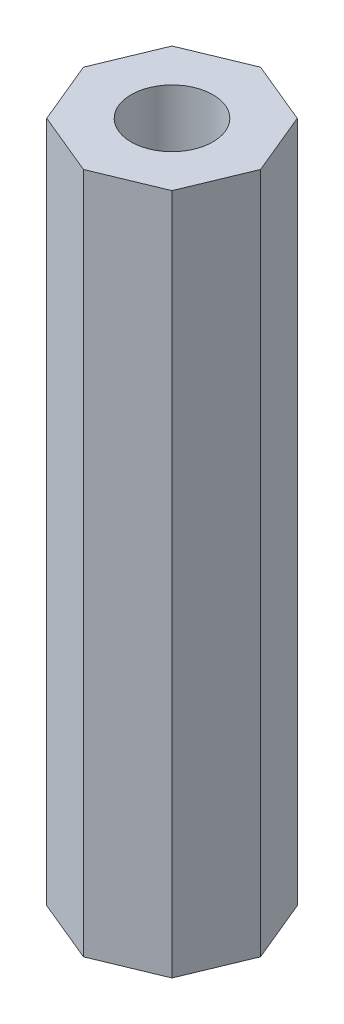
ISO-10303-21;
HEADER;
FILE_DESCRIPTION(('STEP AP214'),'2;1');
FILE_NAME('part.step','',(''),(''),'','','');
FILE_SCHEMA(('AUTOMOTIVE_DESIGN { 1 0 10303 214 1 1 1 1 }'));
ENDSEC;
DATA;
#1=APPLICATION_CONTEXT('core data for automotive mechanical design processes');
#2=APPLICATION_PROTOCOL_DEFINITION('international standard','automotive_design',2000,#1);
#3=PRODUCT_CONTEXT('',#1,'mechanical');
#4=PRODUCT('Part','Part','',(#3));
#5=PRODUCT_RELATED_PRODUCT_CATEGORY('part','',(#4));
#6=PRODUCT_DEFINITION_FORMATION('','',#4);
#7=PRODUCT_DEFINITION_CONTEXT('part definition',#1,'design');
#8=PRODUCT_DEFINITION('design','',#6,#7);
#9=PRODUCT_DEFINITION_SHAPE('','',#8);
#10=(LENGTH_UNIT() NAMED_UNIT(*) SI_UNIT(.MILLI.,.METRE.));
#11=(NAMED_UNIT(*) PLANE_ANGLE_UNIT() SI_UNIT($,.RADIAN.));
#12=(NAMED_UNIT(*) SI_UNIT($,.STERADIAN.) SOLID_ANGLE_UNIT());
#13=UNCERTAINTY_MEASURE_WITH_UNIT(LENGTH_MEASURE(1.E-05),#10,'distance_accuracy_value','');
#14=(GEOMETRIC_REPRESENTATION_CONTEXT(3) GLOBAL_UNCERTAINTY_ASSIGNED_CONTEXT((#13)) GLOBAL_UNIT_ASSIGNED_CONTEXT((#10,
#11,#12)) REPRESENTATION_CONTEXT('',''));
#15=CARTESIAN_POINT('',(0.,0.,0.));
#16=DIRECTION('',(0.,0.,1.));
#17=DIRECTION('',(1.,0.,0.));
#18=AXIS2_PLACEMENT_3D('',#15,#16,#17);
#19=CARTESIAN_POINT('',(0.,12.5,0.));
#20=DIRECTION('',(0.,1.,0.));
#21=DIRECTION('',(0.,0.,1.));
#22=AXIS2_PLACEMENT_3D('',#19,#20,#21);
#23=PLANE('',#22);
#24=DIRECTION('',(0.382683432365078,0.,-0.923879532511292));
#25=VECTOR('',#24,1.);
#26=CARTESIAN_POINT('',(1.14805029709528,12.5,1.14805029709526));
#27=LINE('',#26,#25);
#28=CARTESIAN_POINT('',(1.14805029709528,12.5,1.14805029709526));
#29=VERTEX_POINT('',#28);
#30=CARTESIAN_POINT('',(1.62358830043859,12.5,0.));
#31=VERTEX_POINT('',#30);
#32=EDGE_CURVE('E144',#29,#31,#27,.T.);
#33=ORIENTED_EDGE('',*,*,#32,.T.);
#34=DIRECTION('',(-0.382683432365101,0.,-0.923879532511282));
#35=VECTOR('',#34,1.);
#36=CARTESIAN_POINT('',(1.62358830043859,12.5,0.));
#37=LINE('',#36,#35);
#38=CARTESIAN_POINT('',(1.14805029709525,12.5,-1.14805029709528));
#39=VERTEX_POINT('',#38);
#40=EDGE_CURVE('E92',#31,#39,#37,.T.);
#41=ORIENTED_EDGE('',*,*,#40,.T.);
#42=DIRECTION('',(-0.923879532511292,0.,-0.382683432365078));
#43=VECTOR('',#42,1.);
#44=CARTESIAN_POINT('',(1.14805029709525,12.5,-1.14805029709528));
#45=LINE('',#44,#43);
#46=CARTESIAN_POINT('',(0.,12.5,-1.62358830043859));
#47=VERTEX_POINT('',#46);
#48=EDGE_CURVE('E159',#39,#47,#45,.T.);
#49=ORIENTED_EDGE('',*,*,#48,.T.);
#50=DIRECTION('',(-0.923879532511282,0.,0.382683432365101));
#51=VECTOR('',#50,1.);
#52=CARTESIAN_POINT('',(0.,12.5,-1.62358830043859));
#53=LINE('',#52,#51);
#54=CARTESIAN_POINT('',(-1.14805029709528,12.5,-1.14805029709526));
#55=VERTEX_POINT('',#54);
#56=EDGE_CURVE('E172',#47,#55,#53,.T.);
#57=ORIENTED_EDGE('',*,*,#56,.T.);
#58=DIRECTION('',(-0.382683432365078,0.,0.923879532511292));
#59=VECTOR('',#58,1.);
#60=CARTESIAN_POINT('',(-1.14805029709528,12.5,-1.14805029709526));
#61=LINE('',#60,#59);
#62=CARTESIAN_POINT('',(-1.62358830043859,12.5,0.));
#63=VERTEX_POINT('',#62);
#64=EDGE_CURVE('E111',#55,#63,#61,.T.);
#65=ORIENTED_EDGE('',*,*,#64,.T.);
#66=DIRECTION('',(0.382683432365101,0.,0.923879532511282));
#67=VECTOR('',#66,1.);
#68=CARTESIAN_POINT('',(-1.62358830043859,12.5,0.));
#69=LINE('',#68,#67);
#70=CARTESIAN_POINT('',(-1.14805029709526,12.5,1.14805029709528));
#71=VERTEX_POINT('',#70);
#72=EDGE_CURVE('E105',#63,#71,#69,.T.);
#73=ORIENTED_EDGE('',*,*,#72,.T.);
#74=DIRECTION('',(0.923879532511292,0.,0.382683432365078));
#75=VECTOR('',#74,1.);
#76=CARTESIAN_POINT('',(-1.14805029709526,12.5,1.14805029709528));
#77=LINE('',#76,#75);
#78=CARTESIAN_POINT('',(0.,12.5,1.62358830043859));
#79=VERTEX_POINT('',#78);
#80=EDGE_CURVE('E109',#71,#79,#77,.T.);
#81=ORIENTED_EDGE('',*,*,#80,.T.);
#82=DIRECTION('',(0.923879532511282,0.,-0.382683432365101));
#83=VECTOR('',#82,1.);
#84=CARTESIAN_POINT('',(0.,12.5,1.62358830043859));
#85=LINE('',#84,#83);
#86=EDGE_CURVE('E49',#79,#29,#85,.T.);
#87=ORIENTED_EDGE('',*,*,#86,.T.);
#88=EDGE_LOOP('',(#33,#41,#49,#57,#65,#73,#81,#87));
#89=FACE_BOUND('',#88,.T.);
#90=CARTESIAN_POINT('',(0.,12.5,0.));
#91=DIRECTION('',(0.,1.,0.));
#92=DIRECTION('',(0.,0.,1.));
#93=AXIS2_PLACEMENT_3D('',#90,#91,#92);
#94=CIRCLE('',#93,0.75);
#95=CARTESIAN_POINT('',(0.,12.5,0.75));
#96=VERTEX_POINT('',#95);
#97=EDGE_CURVE('E133',#96,#96,#94,.T.);
#98=ORIENTED_EDGE('',*,*,#97,.F.);
#99=EDGE_LOOP('',(#98));
#100=FACE_BOUND('',#99,.T.);
#101=ADVANCED_FACE('F32',(#89,#100),#23,.T.);
#102=CARTESIAN_POINT('',(0.,0.,0.));
#103=DIRECTION('',(0.,1.,0.));
#104=DIRECTION('',(0.,0.,1.));
#105=AXIS2_PLACEMENT_3D('',#102,#103,#104);
#106=PLANE('',#105);
#107=DIRECTION('',(0.382683432365078,0.,-0.923879532511292));
#108=VECTOR('',#107,1.);
#109=CARTESIAN_POINT('',(1.14805029709528,0.,1.14805029709526));
#110=LINE('',#109,#108);
#111=CARTESIAN_POINT('',(1.14805029709528,0.,1.14805029709526));
#112=VERTEX_POINT('',#111);
#113=CARTESIAN_POINT('',(1.62358830043859,0.,0.));
#114=VERTEX_POINT('',#113);
#115=EDGE_CURVE('E129',#112,#114,#110,.T.);
#116=ORIENTED_EDGE('',*,*,#115,.F.);
#117=DIRECTION('',(0.923879532511282,0.,-0.382683432365101));
#118=VECTOR('',#117,1.);
#119=CARTESIAN_POINT('',(0.,0.,1.62358830043859));
#120=LINE('',#119,#118);
#121=CARTESIAN_POINT('',(0.,0.,1.62358830043859));
#122=VERTEX_POINT('',#121);
#123=EDGE_CURVE('E84',#122,#112,#120,.T.);
#124=ORIENTED_EDGE('',*,*,#123,.F.);
#125=DIRECTION('',(0.923879532511292,0.,0.382683432365078));
#126=VECTOR('',#125,1.);
#127=CARTESIAN_POINT('',(-1.14805029709526,0.,1.14805029709528));
#128=LINE('',#127,#126);
#129=CARTESIAN_POINT('',(-1.14805029709526,0.,1.14805029709528));
#130=VERTEX_POINT('',#129);
#131=EDGE_CURVE('E78',#130,#122,#128,.T.);
#132=ORIENTED_EDGE('',*,*,#131,.F.);
#133=DIRECTION('',(0.382683432365101,0.,0.923879532511282));
#134=VECTOR('',#133,1.);
#135=CARTESIAN_POINT('',(-1.62358830043859,0.,0.));
#136=LINE('',#135,#134);
#137=CARTESIAN_POINT('',(-1.62358830043859,0.,0.));
#138=VERTEX_POINT('',#137);
#139=EDGE_CURVE('E119',#138,#130,#136,.T.);
#140=ORIENTED_EDGE('',*,*,#139,.F.);
#141=DIRECTION('',(-0.382683432365078,0.,0.923879532511292));
#142=VECTOR('',#141,1.);
#143=CARTESIAN_POINT('',(-1.14805029709528,0.,-1.14805029709526));
#144=LINE('',#143,#142);
#145=CARTESIAN_POINT('',(-1.14805029709528,0.,-1.14805029709526));
#146=VERTEX_POINT('',#145);
#147=EDGE_CURVE('E139',#146,#138,#144,.T.);
#148=ORIENTED_EDGE('',*,*,#147,.F.);
#149=DIRECTION('',(-0.923879532511282,0.,0.382683432365101));
#150=VECTOR('',#149,1.);
#151=CARTESIAN_POINT('',(0.,0.,-1.62358830043859));
#152=LINE('',#151,#150);
#153=CARTESIAN_POINT('',(0.,0.,-1.62358830043859));
#154=VERTEX_POINT('',#153);
#155=EDGE_CURVE('E137',#154,#146,#152,.T.);
#156=ORIENTED_EDGE('',*,*,#155,.F.);
#157=DIRECTION('',(-0.923879532511292,0.,-0.382683432365078));
#158=VECTOR('',#157,1.);
#159=CARTESIAN_POINT('',(1.14805029709525,0.,-1.14805029709528));
#160=LINE('',#159,#158);
#161=CARTESIAN_POINT('',(1.14805029709525,0.,-1.14805029709528));
#162=VERTEX_POINT('',#161);
#163=EDGE_CURVE('E135',#162,#154,#160,.T.);
#164=ORIENTED_EDGE('',*,*,#163,.F.);
#165=DIRECTION('',(-0.382683432365101,0.,-0.923879532511282));
#166=VECTOR('',#165,1.);
#167=CARTESIAN_POINT('',(1.62358830043859,0.,0.));
#168=LINE('',#167,#166);
#169=EDGE_CURVE('E132',#114,#162,#168,.T.);
#170=ORIENTED_EDGE('',*,*,#169,.F.);
#171=EDGE_LOOP('',(#116,#124,#132,#140,#148,#156,#164,#170));
#172=FACE_BOUND('',#171,.T.);
#173=CARTESIAN_POINT('',(0.,0.,0.));
#174=DIRECTION('',(0.,1.,0.));
#175=DIRECTION('',(0.,0.,1.));
#176=AXIS2_PLACEMENT_3D('',#173,#174,#175);
#177=CIRCLE('',#176,0.75);
#178=CARTESIAN_POINT('',(0.,0.,0.75));
#179=VERTEX_POINT('',#178);
#180=EDGE_CURVE('E178',#179,#179,#177,.T.);
#181=ORIENTED_EDGE('',*,*,#180,.T.);
#182=EDGE_LOOP('',(#181));
#183=FACE_BOUND('',#182,.T.);
#184=ADVANCED_FACE('F163',(#172,#183),#106,.F.);
#185=CARTESIAN_POINT('',(1.14805029709528,12.5,1.14805029709526));
#186=DIRECTION('',(-0.923879532511292,0.,-0.382683432365078));
#187=DIRECTION('',(-0.382683432365078,0.,0.923879532511292));
#188=AXIS2_PLACEMENT_3D('',#185,#186,#187);
#189=PLANE('',#188);
#190=ORIENTED_EDGE('',*,*,#115,.T.);
#191=DIRECTION('',(0.,-1.,0.));
#192=VECTOR('',#191,1.);
#193=CARTESIAN_POINT('',(1.62358830043859,12.5,0.));
#194=LINE('',#193,#192);
#195=EDGE_CURVE('E11',#31,#114,#194,.T.);
#196=ORIENTED_EDGE('',*,*,#195,.F.);
#197=ORIENTED_EDGE('',*,*,#32,.F.);
#198=DIRECTION('',(0.,-1.,0.));
#199=VECTOR('',#198,1.);
#200=CARTESIAN_POINT('',(1.14805029709528,12.5,1.14805029709526));
#201=LINE('',#200,#199);
#202=EDGE_CURVE('E125',#29,#112,#201,.T.);
#203=ORIENTED_EDGE('',*,*,#202,.T.);
#204=EDGE_LOOP('',(#190,#196,#197,#203));
#205=FACE_BOUND('',#204,.T.);
#206=ADVANCED_FACE('F34',(#205),#189,.F.);
#207=CARTESIAN_POINT('',(1.62358830043859,12.5,0.));
#208=DIRECTION('',(-0.923879532511282,0.,0.382683432365101));
#209=DIRECTION('',(0.382683432365101,0.,0.923879532511282));
#210=AXIS2_PLACEMENT_3D('',#207,#208,#209);
#211=PLANE('',#210);
#212=ORIENTED_EDGE('',*,*,#169,.T.);
#213=DIRECTION('',(0.,-1.,0.));
#214=VECTOR('',#213,1.);
#215=CARTESIAN_POINT('',(1.14805029709525,12.5,-1.14805029709528));
#216=LINE('',#215,#214);
#217=EDGE_CURVE('E41',#39,#162,#216,.T.);
#218=ORIENTED_EDGE('',*,*,#217,.F.);
#219=ORIENTED_EDGE('',*,*,#40,.F.);
#220=ORIENTED_EDGE('',*,*,#195,.T.);
#221=EDGE_LOOP('',(#212,#218,#219,#220));
#222=FACE_BOUND('',#221,.T.);
#223=ADVANCED_FACE('F206',(#222),#211,.F.);
#224=CARTESIAN_POINT('',(1.14805029709525,12.5,-1.14805029709528));
#225=DIRECTION('',(-0.382683432365078,0.,0.923879532511292));
#226=DIRECTION('',(0.923879532511292,0.,0.382683432365078));
#227=AXIS2_PLACEMENT_3D('',#224,#225,#226);
#228=PLANE('',#227);
#229=ORIENTED_EDGE('',*,*,#163,.T.);
#230=DIRECTION('',(0.,-1.,0.));
#231=VECTOR('',#230,1.);
#232=CARTESIAN_POINT('',(0.,12.5,-1.62358830043859));
#233=LINE('',#232,#231);
#234=EDGE_CURVE('E151',#47,#154,#233,.T.);
#235=ORIENTED_EDGE('',*,*,#234,.F.);
#236=ORIENTED_EDGE('',*,*,#48,.F.);
#237=ORIENTED_EDGE('',*,*,#217,.T.);
#238=EDGE_LOOP('',(#229,#235,#236,#237));
#239=FACE_BOUND('',#238,.T.);
#240=ADVANCED_FACE('F157',(#239),#228,.F.);
#241=CARTESIAN_POINT('',(0.,12.5,-1.62358830043859));
#242=DIRECTION('',(0.382683432365101,0.,0.923879532511282));
#243=DIRECTION('',(0.923879532511282,0.,-0.382683432365101));
#244=AXIS2_PLACEMENT_3D('',#241,#242,#243);
#245=PLANE('',#244);
#246=ORIENTED_EDGE('',*,*,#155,.T.);
#247=DIRECTION('',(0.,-1.,0.));
#248=VECTOR('',#247,1.);
#249=CARTESIAN_POINT('',(-1.14805029709528,12.5,-1.14805029709526));
#250=LINE('',#249,#248);
#251=EDGE_CURVE('E148',#55,#146,#250,.T.);
#252=ORIENTED_EDGE('',*,*,#251,.F.);
#253=ORIENTED_EDGE('',*,*,#56,.F.);
#254=ORIENTED_EDGE('',*,*,#234,.T.);
#255=EDGE_LOOP('',(#246,#252,#253,#254));
#256=FACE_BOUND('',#255,.T.);
#257=ADVANCED_FACE('F168',(#256),#245,.F.);
#258=CARTESIAN_POINT('',(-1.14805029709528,12.5,-1.14805029709526));
#259=DIRECTION('',(0.923879532511292,0.,0.382683432365078));
#260=DIRECTION('',(0.382683432365078,0.,-0.923879532511292));
#261=AXIS2_PLACEMENT_3D('',#258,#259,#260);
#262=PLANE('',#261);
#263=ORIENTED_EDGE('',*,*,#147,.T.);
#264=DIRECTION('',(0.,-1.,0.));
#265=VECTOR('',#264,1.);
#266=CARTESIAN_POINT('',(-1.62358830043859,12.5,0.));
#267=LINE('',#266,#265);
#268=EDGE_CURVE('E120',#63,#138,#267,.T.);
#269=ORIENTED_EDGE('',*,*,#268,.F.);
#270=ORIENTED_EDGE('',*,*,#64,.F.);
#271=ORIENTED_EDGE('',*,*,#251,.T.);
#272=EDGE_LOOP('',(#263,#269,#270,#271));
#273=FACE_BOUND('',#272,.T.);
#274=ADVANCED_FACE('F171',(#273),#262,.F.);
#275=CARTESIAN_POINT('',(-1.62358830043859,12.5,0.));
#276=DIRECTION('',(0.923879532511282,0.,-0.382683432365101));
#277=DIRECTION('',(-0.382683432365101,0.,-0.923879532511282));
#278=AXIS2_PLACEMENT_3D('',#275,#276,#277);
#279=PLANE('',#278);
#280=ORIENTED_EDGE('',*,*,#139,.T.);
#281=DIRECTION('',(0.,-1.,0.));
#282=VECTOR('',#281,1.);
#283=CARTESIAN_POINT('',(-1.14805029709526,12.5,1.14805029709528));
#284=LINE('',#283,#282);
#285=EDGE_CURVE('E116',#71,#130,#284,.T.);
#286=ORIENTED_EDGE('',*,*,#285,.F.);
#287=ORIENTED_EDGE('',*,*,#72,.F.);
#288=ORIENTED_EDGE('',*,*,#268,.T.);
#289=EDGE_LOOP('',(#280,#286,#287,#288));
#290=FACE_BOUND('',#289,.T.);
#291=ADVANCED_FACE('F117',(#290),#279,.F.);
#292=CARTESIAN_POINT('',(-1.14805029709526,12.5,1.14805029709528));
#293=DIRECTION('',(0.382683432365078,0.,-0.923879532511292));
#294=DIRECTION('',(-0.923879532511292,0.,-0.382683432365078));
#295=AXIS2_PLACEMENT_3D('',#292,#293,#294);
#296=PLANE('',#295);
#297=ORIENTED_EDGE('',*,*,#131,.T.);
#298=DIRECTION('',(0.,-1.,0.));
#299=VECTOR('',#298,1.);
#300=CARTESIAN_POINT('',(0.,12.5,1.62358830043859));
#301=LINE('',#300,#299);
#302=EDGE_CURVE('E121',#79,#122,#301,.T.);
#303=ORIENTED_EDGE('',*,*,#302,.F.);
#304=ORIENTED_EDGE('',*,*,#80,.F.);
#305=ORIENTED_EDGE('',*,*,#285,.T.);
#306=EDGE_LOOP('',(#297,#303,#304,#305));
#307=FACE_BOUND('',#306,.T.);
#308=ADVANCED_FACE('F123',(#307),#296,.F.);
#309=CARTESIAN_POINT('',(0.,12.5,1.62358830043859));
#310=DIRECTION('',(-0.382683432365101,0.,-0.923879532511282));
#311=DIRECTION('',(-0.923879532511282,0.,0.382683432365101));
#312=AXIS2_PLACEMENT_3D('',#309,#310,#311);
#313=PLANE('',#312);
#314=ORIENTED_EDGE('',*,*,#123,.T.);
#315=ORIENTED_EDGE('',*,*,#202,.F.);
#316=ORIENTED_EDGE('',*,*,#86,.F.);
#317=ORIENTED_EDGE('',*,*,#302,.T.);
#318=EDGE_LOOP('',(#314,#315,#316,#317));
#319=FACE_BOUND('',#318,.T.);
#320=ADVANCED_FACE('F194',(#319),#313,.F.);
#321=CARTESIAN_POINT('',(0.,12.5,0.));
#322=DIRECTION('',(0.,-1.,0.));
#323=DIRECTION('',(0.,0.,-1.));
#324=AXIS2_PLACEMENT_3D('',#321,#322,#323);
#325=CYLINDRICAL_SURFACE('',#324,0.75);
#326=ORIENTED_EDGE('',*,*,#97,.T.);
#327=EDGE_LOOP('',(#326));
#328=FACE_BOUND('',#327,.T.);
#329=ORIENTED_EDGE('',*,*,#180,.F.);
#330=EDGE_LOOP('',(#329));
#331=FACE_BOUND('',#330,.T.);
#332=ADVANCED_FACE('F184',(#328,#331),#325,.F.);
#333=CLOSED_SHELL('',(#101,#184,#206,#223,#240,#257,#274,#291,#308,#320,#332));
#334=MANIFOLD_SOLID_BREP('B2',#333);
#335=ADVANCED_BREP_SHAPE_REPRESENTATION('',(#18,#334),#14);
#336=SHAPE_DEFINITION_REPRESENTATION(#9,#335);
ENDSEC;
END-ISO-10303-21;
